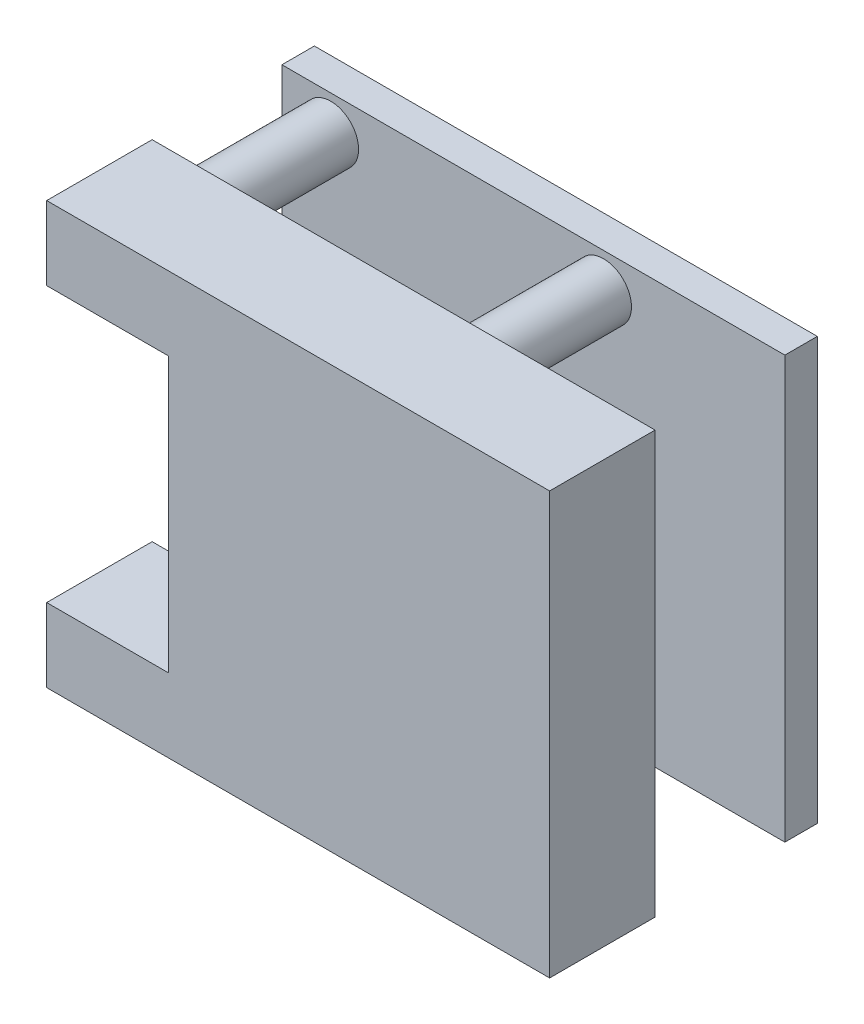
ISO-10303-21;
HEADER;
FILE_DESCRIPTION(('STEP AP214'),'2;1');
FILE_NAME('part.step','',(''),(''),'','','');
FILE_SCHEMA(('AUTOMOTIVE_DESIGN { 1 0 10303 214 1 1 1 1 }'));
ENDSEC;
DATA;
#1=APPLICATION_CONTEXT('core data for automotive mechanical design processes');
#2=APPLICATION_PROTOCOL_DEFINITION('international standard','automotive_design',2000,#1);
#3=PRODUCT_CONTEXT('',#1,'mechanical');
#4=PRODUCT('Part','Part','',(#3));
#5=PRODUCT_RELATED_PRODUCT_CATEGORY('part','',(#4));
#6=PRODUCT_DEFINITION_FORMATION('','',#4);
#7=PRODUCT_DEFINITION_CONTEXT('part definition',#1,'design');
#8=PRODUCT_DEFINITION('design','',#6,#7);
#9=PRODUCT_DEFINITION_SHAPE('','',#8);
#10=(LENGTH_UNIT() NAMED_UNIT(*) SI_UNIT(.MILLI.,.METRE.));
#11=(NAMED_UNIT(*) PLANE_ANGLE_UNIT() SI_UNIT($,.RADIAN.));
#12=(NAMED_UNIT(*) SI_UNIT($,.STERADIAN.) SOLID_ANGLE_UNIT());
#13=UNCERTAINTY_MEASURE_WITH_UNIT(LENGTH_MEASURE(1.E-05),#10,'distance_accuracy_value','');
#14=(GEOMETRIC_REPRESENTATION_CONTEXT(3) GLOBAL_UNCERTAINTY_ASSIGNED_CONTEXT((#13)) GLOBAL_UNIT_ASSIGNED_CONTEXT((#10,
#11,#12)) REPRESENTATION_CONTEXT('',''));
#15=CARTESIAN_POINT('',(0.,0.,0.));
#16=DIRECTION('',(0.,0.,1.));
#17=DIRECTION('',(1.,0.,0.));
#18=AXIS2_PLACEMENT_3D('',#15,#16,#17);
#19=CARTESIAN_POINT('',(0.,0.,16.5));
#20=DIRECTION('',(1.,0.,0.));
#21=DIRECTION('',(0.,0.,-1.));
#22=AXIS2_PLACEMENT_3D('',#19,#20,#21);
#23=PLANE('',#22);
#24=DIRECTION('',(0.,-1.,0.));
#25=VECTOR('',#24,1.);
#26=CARTESIAN_POINT('',(0.,0.,2.));
#27=LINE('',#26,#25);
#28=CARTESIAN_POINT('',(0.,26.,2.));
#29=VERTEX_POINT('',#28);
#30=CARTESIAN_POINT('',(0.,0.,2.));
#31=VERTEX_POINT('',#30);
#32=EDGE_CURVE('E172',#29,#31,#27,.T.);
#33=ORIENTED_EDGE('',*,*,#32,.F.);
#34=DIRECTION('',(0.,0.,-1.));
#35=VECTOR('',#34,1.);
#36=CARTESIAN_POINT('',(0.,26.,16.5));
#37=LINE('',#36,#35);
#38=CARTESIAN_POINT('',(0.,26.,0.));
#39=VERTEX_POINT('',#38);
#40=EDGE_CURVE('E166',#29,#39,#37,.T.);
#41=ORIENTED_EDGE('',*,*,#40,.T.);
#42=DIRECTION('',(0.,-1.,0.));
#43=VECTOR('',#42,1.);
#44=CARTESIAN_POINT('',(0.,0.,0.));
#45=LINE('',#44,#43);
#46=CARTESIAN_POINT('',(0.,0.,0.));
#47=VERTEX_POINT('',#46);
#48=EDGE_CURVE('E167',#39,#47,#45,.T.);
#49=ORIENTED_EDGE('',*,*,#48,.T.);
#50=DIRECTION('',(0.,0.,-1.));
#51=VECTOR('',#50,1.);
#52=CARTESIAN_POINT('',(0.,0.,16.5));
#53=LINE('',#52,#51);
#54=EDGE_CURVE('E196',#31,#47,#53,.T.);
#55=ORIENTED_EDGE('',*,*,#54,.F.);
#56=EDGE_LOOP('',(#33,#41,#49,#55));
#57=FACE_BOUND('',#56,.T.);
#58=ADVANCED_FACE('F39',(#57),#23,.F.);
#59=DIRECTION('',(0.,-1.,0.));
#60=VECTOR('',#59,1.);
#61=CARTESIAN_POINT('',(0.,0.,16.5));
#62=LINE('',#61,#60);
#63=CARTESIAN_POINT('',(0.,4.54167812983419,16.5));
#64=VERTEX_POINT('',#63);
#65=CARTESIAN_POINT('',(0.,0.,16.5));
#66=VERTEX_POINT('',#65);
#67=EDGE_CURVE('E151',#64,#66,#62,.T.);
#68=ORIENTED_EDGE('',*,*,#67,.F.);
#69=DIRECTION('',(0.,0.,1.));
#70=VECTOR('',#69,1.);
#71=CARTESIAN_POINT('',(0.,4.54167812983419,-16.5053993019197));
#72=LINE('',#71,#70);
#73=CARTESIAN_POINT('',(0.,4.54167812983419,10.));
#74=VERTEX_POINT('',#73);
#75=EDGE_CURVE('E143',#74,#64,#72,.T.);
#76=ORIENTED_EDGE('',*,*,#75,.F.);
#77=DIRECTION('',(0.,-1.,0.));
#78=VECTOR('',#77,1.);
#79=CARTESIAN_POINT('',(0.,0.,10.));
#80=LINE('',#79,#78);
#81=CARTESIAN_POINT('',(0.,0.,10.));
#82=VERTEX_POINT('',#81);
#83=EDGE_CURVE('E159',#74,#82,#80,.T.);
#84=ORIENTED_EDGE('',*,*,#83,.T.);
#85=EDGE_CURVE('E197',#66,#82,#53,.T.);
#86=ORIENTED_EDGE('',*,*,#85,.F.);
#87=EDGE_LOOP('',(#68,#76,#84,#86));
#88=FACE_BOUND('',#87,.T.);
#89=ADVANCED_FACE('F290',(#88),#23,.F.);
#90=CARTESIAN_POINT('',(0.,0.,16.5));
#91=DIRECTION('',(0.,1.,0.));
#92=DIRECTION('',(0.,0.,1.));
#93=AXIS2_PLACEMENT_3D('',#90,#91,#92);
#94=PLANE('',#93);
#95=DIRECTION('',(1.,0.,0.));
#96=VECTOR('',#95,1.);
#97=CARTESIAN_POINT('',(31.,0.,10.));
#98=LINE('',#97,#96);
#99=CARTESIAN_POINT('',(31.,0.,10.));
#100=VERTEX_POINT('',#99);
#101=EDGE_CURVE('E222',#82,#100,#98,.T.);
#102=ORIENTED_EDGE('',*,*,#101,.T.);
#103=DIRECTION('',(0.,0.,-1.));
#104=VECTOR('',#103,1.);
#105=CARTESIAN_POINT('',(31.,0.,16.5));
#106=LINE('',#105,#104);
#107=CARTESIAN_POINT('',(31.,0.,16.5));
#108=VERTEX_POINT('',#107);
#109=EDGE_CURVE('E192',#108,#100,#106,.T.);
#110=ORIENTED_EDGE('',*,*,#109,.F.);
#111=DIRECTION('',(1.,0.,0.));
#112=VECTOR('',#111,1.);
#113=CARTESIAN_POINT('',(0.,0.,16.5));
#114=LINE('',#113,#112);
#115=EDGE_CURVE('E150',#66,#108,#114,.T.);
#116=ORIENTED_EDGE('',*,*,#115,.F.);
#117=ORIENTED_EDGE('',*,*,#85,.T.);
#118=EDGE_LOOP('',(#102,#110,#116,#117));
#119=FACE_BOUND('',#118,.T.);
#120=ADVANCED_FACE('F292',(#119),#94,.F.);
#121=CARTESIAN_POINT('',(31.,0.,16.5));
#122=DIRECTION('',(-1.,0.,0.));
#123=DIRECTION('',(0.,0.,1.));
#124=AXIS2_PLACEMENT_3D('',#121,#122,#123);
#125=PLANE('',#124);
#126=DIRECTION('',(0.,1.,0.));
#127=VECTOR('',#126,1.);
#128=CARTESIAN_POINT('',(31.,26.,10.));
#129=LINE('',#128,#127);
#130=CARTESIAN_POINT('',(31.,26.,10.));
#131=VERTEX_POINT('',#130);
#132=EDGE_CURVE('E233',#100,#131,#129,.T.);
#133=ORIENTED_EDGE('',*,*,#132,.T.);
#134=DIRECTION('',(0.,0.,-1.));
#135=VECTOR('',#134,1.);
#136=CARTESIAN_POINT('',(31.,26.,16.5));
#137=LINE('',#136,#135);
#138=CARTESIAN_POINT('',(31.,26.,16.5));
#139=VERTEX_POINT('',#138);
#140=EDGE_CURVE('E187',#139,#131,#137,.T.);
#141=ORIENTED_EDGE('',*,*,#140,.F.);
#142=DIRECTION('',(0.,1.,0.));
#143=VECTOR('',#142,1.);
#144=CARTESIAN_POINT('',(31.,0.,16.5));
#145=LINE('',#144,#143);
#146=EDGE_CURVE('E155',#108,#139,#145,.T.);
#147=ORIENTED_EDGE('',*,*,#146,.F.);
#148=ORIENTED_EDGE('',*,*,#109,.T.);
#149=EDGE_LOOP('',(#133,#141,#147,#148));
#150=FACE_BOUND('',#149,.T.);
#151=ADVANCED_FACE('F297',(#150),#125,.F.);
#152=CARTESIAN_POINT('',(0.,26.,16.5));
#153=DIRECTION('',(0.,-1.,0.));
#154=DIRECTION('',(0.,0.,-1.));
#155=AXIS2_PLACEMENT_3D('',#152,#153,#154);
#156=PLANE('',#155);
#157=DIRECTION('',(-1.,0.,0.));
#158=VECTOR('',#157,1.);
#159=CARTESIAN_POINT('',(0.,26.,10.));
#160=LINE('',#159,#158);
#161=CARTESIAN_POINT('',(0.,26.,10.));
#162=VERTEX_POINT('',#161);
#163=EDGE_CURVE('E231',#131,#162,#160,.T.);
#164=ORIENTED_EDGE('',*,*,#163,.T.);
#165=CARTESIAN_POINT('',(0.,26.,16.5));
#166=VERTEX_POINT('',#165);
#167=EDGE_CURVE('E183',#166,#162,#37,.T.);
#168=ORIENTED_EDGE('',*,*,#167,.F.);
#169=DIRECTION('',(-1.,0.,0.));
#170=VECTOR('',#169,1.);
#171=CARTESIAN_POINT('',(0.,26.,16.5));
#172=LINE('',#171,#170);
#173=EDGE_CURVE('E147',#139,#166,#172,.T.);
#174=ORIENTED_EDGE('',*,*,#173,.F.);
#175=ORIENTED_EDGE('',*,*,#140,.T.);
#176=EDGE_LOOP('',(#164,#168,#174,#175));
#177=FACE_BOUND('',#176,.T.);
#178=ADVANCED_FACE('F299',(#177),#156,.F.);
#179=DIRECTION('',(0.,-1.,0.));
#180=VECTOR('',#179,1.);
#181=CARTESIAN_POINT('',(0.,21.3676644107974,10.));
#182=LINE('',#181,#180);
#183=CARTESIAN_POINT('',(0.,21.4583218701658,10.));
#184=VERTEX_POINT('',#183);
#185=EDGE_CURVE('E62',#162,#184,#182,.T.);
#186=ORIENTED_EDGE('',*,*,#185,.T.);
#187=DIRECTION('',(0.,0.,1.));
#188=VECTOR('',#187,1.);
#189=CARTESIAN_POINT('',(0.,21.4583218701658,-16.5053993019197));
#190=LINE('',#189,#188);
#191=CARTESIAN_POINT('',(0.,21.4583218701658,16.5));
#192=VERTEX_POINT('',#191);
#193=EDGE_CURVE('E55',#184,#192,#190,.T.);
#194=ORIENTED_EDGE('',*,*,#193,.T.);
#195=EDGE_CURVE('E141',#166,#192,#62,.T.);
#196=ORIENTED_EDGE('',*,*,#195,.F.);
#197=ORIENTED_EDGE('',*,*,#167,.T.);
#198=EDGE_LOOP('',(#186,#194,#196,#197));
#199=FACE_BOUND('',#198,.T.);
#200=ADVANCED_FACE('F41',(#199),#23,.F.);
#201=CARTESIAN_POINT('',(31.,0.,2.));
#202=VERTEX_POINT('',#201);
#203=CARTESIAN_POINT('',(31.,0.,0.));
#204=VERTEX_POINT('',#203);
#205=EDGE_CURVE('E191',#202,#204,#106,.T.);
#206=ORIENTED_EDGE('',*,*,#205,.F.);
#207=DIRECTION('',(1.,0.,0.));
#208=VECTOR('',#207,1.);
#209=CARTESIAN_POINT('',(31.,0.,2.));
#210=LINE('',#209,#208);
#211=EDGE_CURVE('E226',#31,#202,#210,.T.);
#212=ORIENTED_EDGE('',*,*,#211,.F.);
#213=ORIENTED_EDGE('',*,*,#54,.T.);
#214=DIRECTION('',(1.,0.,0.));
#215=VECTOR('',#214,1.);
#216=CARTESIAN_POINT('',(0.,0.,0.));
#217=LINE('',#216,#215);
#218=EDGE_CURVE('E171',#47,#204,#217,.T.);
#219=ORIENTED_EDGE('',*,*,#218,.T.);
#220=EDGE_LOOP('',(#206,#212,#213,#219));
#221=FACE_BOUND('',#220,.T.);
#222=ADVANCED_FACE('F307',(#221),#94,.F.);
#223=CARTESIAN_POINT('',(31.,26.,2.));
#224=VERTEX_POINT('',#223);
#225=CARTESIAN_POINT('',(31.,26.,0.));
#226=VERTEX_POINT('',#225);
#227=EDGE_CURVE('E186',#224,#226,#137,.T.);
#228=ORIENTED_EDGE('',*,*,#227,.F.);
#229=DIRECTION('',(0.,1.,0.));
#230=VECTOR('',#229,1.);
#231=CARTESIAN_POINT('',(31.,26.,2.));
#232=LINE('',#231,#230);
#233=EDGE_CURVE('E229',#202,#224,#232,.T.);
#234=ORIENTED_EDGE('',*,*,#233,.F.);
#235=ORIENTED_EDGE('',*,*,#205,.T.);
#236=DIRECTION('',(0.,1.,0.));
#237=VECTOR('',#236,1.);
#238=CARTESIAN_POINT('',(31.,0.,0.));
#239=LINE('',#238,#237);
#240=EDGE_CURVE('E176',#204,#226,#239,.T.);
#241=ORIENTED_EDGE('',*,*,#240,.T.);
#242=EDGE_LOOP('',(#228,#234,#235,#241));
#243=FACE_BOUND('',#242,.T.);
#244=ADVANCED_FACE('F309',(#243),#125,.F.);
#245=ORIENTED_EDGE('',*,*,#40,.F.);
#246=DIRECTION('',(-1.,0.,0.));
#247=VECTOR('',#246,1.);
#248=CARTESIAN_POINT('',(0.,26.,2.));
#249=LINE('',#248,#247);
#250=EDGE_CURVE('E244',#224,#29,#249,.T.);
#251=ORIENTED_EDGE('',*,*,#250,.F.);
#252=ORIENTED_EDGE('',*,*,#227,.T.);
#253=DIRECTION('',(-1.,0.,0.));
#254=VECTOR('',#253,1.);
#255=CARTESIAN_POINT('',(0.,26.,0.));
#256=LINE('',#255,#254);
#257=EDGE_CURVE('E157',#226,#39,#256,.T.);
#258=ORIENTED_EDGE('',*,*,#257,.T.);
#259=EDGE_LOOP('',(#245,#251,#252,#258));
#260=FACE_BOUND('',#259,.T.);
#261=ADVANCED_FACE('F302',(#260),#156,.F.);
#262=CARTESIAN_POINT('',(0.,0.,16.5));
#263=DIRECTION('',(0.,0.,-1.));
#264=DIRECTION('',(-1.,0.,0.));
#265=AXIS2_PLACEMENT_3D('',#262,#263,#264);
#266=PLANE('',#265);
#267=DIRECTION('',(0.,1.,0.));
#268=VECTOR('',#267,1.);
#269=CARTESIAN_POINT('',(7.50179764364433,21.4583218701658,16.5));
#270=LINE('',#269,#268);
#271=CARTESIAN_POINT('',(7.50179764364434,4.54167812983419,16.5));
#272=VERTEX_POINT('',#271);
#273=CARTESIAN_POINT('',(7.50179764364433,21.4583218701658,16.5));
#274=VERTEX_POINT('',#273);
#275=EDGE_CURVE('E136',#272,#274,#270,.T.);
#276=ORIENTED_EDGE('',*,*,#275,.F.);
#277=DIRECTION('',(1.,0.,0.));
#278=VECTOR('',#277,1.);
#279=CARTESIAN_POINT('',(0.,4.54167812983419,16.5));
#280=LINE('',#279,#278);
#281=EDGE_CURVE('E214',#64,#272,#280,.T.);
#282=ORIENTED_EDGE('',*,*,#281,.F.);
#283=ORIENTED_EDGE('',*,*,#67,.T.);
#284=ORIENTED_EDGE('',*,*,#115,.T.);
#285=ORIENTED_EDGE('',*,*,#146,.T.);
#286=ORIENTED_EDGE('',*,*,#173,.T.);
#287=ORIENTED_EDGE('',*,*,#195,.T.);
#288=DIRECTION('',(-1.,0.,0.));
#289=VECTOR('',#288,1.);
#290=CARTESIAN_POINT('',(0.,21.4583218701658,16.5));
#291=LINE('',#290,#289);
#292=EDGE_CURVE('E126',#274,#192,#291,.T.);
#293=ORIENTED_EDGE('',*,*,#292,.F.);
#294=EDGE_LOOP('',(#276,#282,#283,#284,#285,#286,#287,#293));
#295=FACE_BOUND('',#294,.T.);
#296=ADVANCED_FACE('F145',(#295),#266,.F.);
#297=CARTESIAN_POINT('',(0.,0.,0.));
#298=DIRECTION('',(0.,0.,-1.));
#299=DIRECTION('',(-1.,0.,0.));
#300=AXIS2_PLACEMENT_3D('',#297,#298,#299);
#301=PLANE('',#300);
#302=ORIENTED_EDGE('',*,*,#48,.F.);
#303=ORIENTED_EDGE('',*,*,#257,.F.);
#304=ORIENTED_EDGE('',*,*,#240,.F.);
#305=ORIENTED_EDGE('',*,*,#218,.F.);
#306=EDGE_LOOP('',(#302,#303,#304,#305));
#307=FACE_BOUND('',#306,.T.);
#308=ADVANCED_FACE('F338',(#307),#301,.T.);
#309=CARTESIAN_POINT('',(0.,0.,2.));
#310=DIRECTION('',(0.,0.,-1.));
#311=DIRECTION('',(-1.,0.,0.));
#312=AXIS2_PLACEMENT_3D('',#309,#310,#311);
#313=PLANE('',#312);
#314=ORIENTED_EDGE('',*,*,#250,.T.);
#315=ORIENTED_EDGE('',*,*,#32,.T.);
#316=ORIENTED_EDGE('',*,*,#211,.T.);
#317=ORIENTED_EDGE('',*,*,#233,.T.);
#318=EDGE_LOOP('',(#314,#315,#316,#317));
#319=FACE_BOUND('',#318,.T.);
#320=CARTESIAN_POINT('',(19.8304571600922,23.8418986767736,2.));
#321=DIRECTION('',(0.,0.,1.));
#322=DIRECTION('',(-1.,0.,0.));
#323=AXIS2_PLACEMENT_3D('',#320,#321,#322);
#324=CIRCLE('',#323,1.71578435381479);
#325=CARTESIAN_POINT('',(18.1146728062774,23.8418986767736,2.));
#326=VERTEX_POINT('',#325);
#327=EDGE_CURVE('E270',#326,#326,#324,.T.);
#328=ORIENTED_EDGE('',*,*,#327,.F.);
#329=EDGE_LOOP('',(#328));
#330=FACE_BOUND('',#329,.T.);
#331=CARTESIAN_POINT('',(3.01025210686046,23.8418986767736,2.));
#332=DIRECTION('',(0.,0.,1.));
#333=DIRECTION('',(-1.,0.,0.));
#334=AXIS2_PLACEMENT_3D('',#331,#332,#333);
#335=CIRCLE('',#334,1.71578435381479);
#336=CARTESIAN_POINT('',(1.29446775304567,23.8418986767736,2.));
#337=VERTEX_POINT('',#336);
#338=EDGE_CURVE('E262',#337,#337,#335,.T.);
#339=ORIENTED_EDGE('',*,*,#338,.F.);
#340=EDGE_LOOP('',(#339));
#341=FACE_BOUND('',#340,.T.);
#342=CARTESIAN_POINT('',(19.8304571600922,2.15810132322638,2.));
#343=DIRECTION('',(0.,0.,1.));
#344=DIRECTION('',(1.,0.,0.));
#345=AXIS2_PLACEMENT_3D('',#342,#343,#344);
#346=CIRCLE('',#345,1.71578435381479);
#347=CARTESIAN_POINT('',(21.546241513907,2.15810132322638,2.));
#348=VERTEX_POINT('',#347);
#349=EDGE_CURVE('E254',#348,#348,#346,.T.);
#350=ORIENTED_EDGE('',*,*,#349,.F.);
#351=EDGE_LOOP('',(#350));
#352=FACE_BOUND('',#351,.T.);
#353=CARTESIAN_POINT('',(3.01025210686046,2.15810132322638,2.));
#354=DIRECTION('',(0.,0.,1.));
#355=DIRECTION('',(1.,0.,0.));
#356=AXIS2_PLACEMENT_3D('',#353,#354,#355);
#357=CIRCLE('',#356,1.71578435381479);
#358=CARTESIAN_POINT('',(4.72603646067525,2.15810132322638,2.));
#359=VERTEX_POINT('',#358);
#360=EDGE_CURVE('E241',#359,#359,#357,.T.);
#361=ORIENTED_EDGE('',*,*,#360,.F.);
#362=EDGE_LOOP('',(#361));
#363=FACE_BOUND('',#362,.T.);
#364=ADVANCED_FACE('F323',(#319,#330,#341,#352,#363),#313,.F.);
#365=CARTESIAN_POINT('',(0.,0.,10.));
#366=DIRECTION('',(0.,0.,-1.));
#367=DIRECTION('',(-1.,0.,0.));
#368=AXIS2_PLACEMENT_3D('',#365,#366,#367);
#369=PLANE('',#368);
#370=DIRECTION('',(-1.,0.,0.));
#371=VECTOR('',#370,1.);
#372=CARTESIAN_POINT('',(0.,4.54167812983419,10.));
#373=LINE('',#372,#371);
#374=CARTESIAN_POINT('',(7.50179764364434,4.54167812983419,10.));
#375=VERTEX_POINT('',#374);
#376=EDGE_CURVE('E11',#375,#74,#373,.T.);
#377=ORIENTED_EDGE('',*,*,#376,.F.);
#378=DIRECTION('',(0.,-1.,0.));
#379=VECTOR('',#378,1.);
#380=CARTESIAN_POINT('',(7.50179764364434,0.,10.));
#381=LINE('',#380,#379);
#382=CARTESIAN_POINT('',(7.50179764364433,21.4583218701658,10.));
#383=VERTEX_POINT('',#382);
#384=EDGE_CURVE('E48',#383,#375,#381,.T.);
#385=ORIENTED_EDGE('',*,*,#384,.F.);
#386=DIRECTION('',(1.,0.,0.));
#387=VECTOR('',#386,1.);
#388=CARTESIAN_POINT('',(0.,21.4583218701658,10.));
#389=LINE('',#388,#387);
#390=EDGE_CURVE('E201',#184,#383,#389,.T.);
#391=ORIENTED_EDGE('',*,*,#390,.F.);
#392=ORIENTED_EDGE('',*,*,#185,.F.);
#393=ORIENTED_EDGE('',*,*,#163,.F.);
#394=ORIENTED_EDGE('',*,*,#132,.F.);
#395=ORIENTED_EDGE('',*,*,#101,.F.);
#396=ORIENTED_EDGE('',*,*,#83,.F.);
#397=EDGE_LOOP('',(#377,#385,#391,#392,#393,#394,#395,#396));
#398=FACE_BOUND('',#397,.T.);
#399=CARTESIAN_POINT('',(19.8304571600922,23.8418986767736,10.));
#400=DIRECTION('',(0.,0.,1.));
#401=DIRECTION('',(-1.,0.,0.));
#402=AXIS2_PLACEMENT_3D('',#399,#400,#401);
#403=CIRCLE('',#402,1.71578435381479);
#404=CARTESIAN_POINT('',(18.1146728062774,23.8418986767736,10.));
#405=VERTEX_POINT('',#404);
#406=EDGE_CURVE('E274',#405,#405,#403,.T.);
#407=ORIENTED_EDGE('',*,*,#406,.T.);
#408=EDGE_LOOP('',(#407));
#409=FACE_BOUND('',#408,.T.);
#410=CARTESIAN_POINT('',(3.01025210686046,23.8418986767736,10.));
#411=DIRECTION('',(0.,0.,1.));
#412=DIRECTION('',(-1.,0.,0.));
#413=AXIS2_PLACEMENT_3D('',#410,#411,#412);
#414=CIRCLE('',#413,1.71578435381479);
#415=CARTESIAN_POINT('',(1.29446775304567,23.8418986767736,10.));
#416=VERTEX_POINT('',#415);
#417=EDGE_CURVE('E266',#416,#416,#414,.T.);
#418=ORIENTED_EDGE('',*,*,#417,.T.);
#419=EDGE_LOOP('',(#418));
#420=FACE_BOUND('',#419,.T.);
#421=CARTESIAN_POINT('',(19.8304571600922,2.15810132322638,10.));
#422=DIRECTION('',(0.,0.,1.));
#423=DIRECTION('',(1.,0.,0.));
#424=AXIS2_PLACEMENT_3D('',#421,#422,#423);
#425=CIRCLE('',#424,1.71578435381479);
#426=CARTESIAN_POINT('',(21.546241513907,2.15810132322638,10.));
#427=VERTEX_POINT('',#426);
#428=EDGE_CURVE('E258',#427,#427,#425,.T.);
#429=ORIENTED_EDGE('',*,*,#428,.T.);
#430=EDGE_LOOP('',(#429));
#431=FACE_BOUND('',#430,.T.);
#432=CARTESIAN_POINT('',(3.01025210686046,2.15810132322638,10.));
#433=DIRECTION('',(0.,0.,1.));
#434=DIRECTION('',(1.,0.,0.));
#435=AXIS2_PLACEMENT_3D('',#432,#433,#434);
#436=CIRCLE('',#435,1.71578435381479);
#437=CARTESIAN_POINT('',(4.72603646067525,2.15810132322638,10.));
#438=VERTEX_POINT('',#437);
#439=EDGE_CURVE('E250',#438,#438,#436,.T.);
#440=ORIENTED_EDGE('',*,*,#439,.T.);
#441=EDGE_LOOP('',(#440));
#442=FACE_BOUND('',#441,.T.);
#443=ADVANCED_FACE('F218',(#398,#409,#420,#431,#442),#369,.T.);
#444=CARTESIAN_POINT('',(3.01025210686046,2.15810132322638,2.));
#445=DIRECTION('',(0.,0.,1.));
#446=DIRECTION('',(1.,0.,0.));
#447=AXIS2_PLACEMENT_3D('',#444,#445,#446);
#448=CYLINDRICAL_SURFACE('',#447,1.71578435381479);
#449=ORIENTED_EDGE('',*,*,#360,.T.);
#450=EDGE_LOOP('',(#449));
#451=FACE_BOUND('',#450,.T.);
#452=ORIENTED_EDGE('',*,*,#439,.F.);
#453=EDGE_LOOP('',(#452));
#454=FACE_BOUND('',#453,.T.);
#455=ADVANCED_FACE('F383',(#451,#454),#448,.T.);
#456=CARTESIAN_POINT('',(19.8304571600922,2.15810132322638,2.));
#457=DIRECTION('',(0.,0.,1.));
#458=DIRECTION('',(1.,0.,0.));
#459=AXIS2_PLACEMENT_3D('',#456,#457,#458);
#460=CYLINDRICAL_SURFACE('',#459,1.71578435381479);
#461=ORIENTED_EDGE('',*,*,#349,.T.);
#462=EDGE_LOOP('',(#461));
#463=FACE_BOUND('',#462,.T.);
#464=ORIENTED_EDGE('',*,*,#428,.F.);
#465=EDGE_LOOP('',(#464));
#466=FACE_BOUND('',#465,.T.);
#467=ADVANCED_FACE('F388',(#463,#466),#460,.T.);
#468=CARTESIAN_POINT('',(3.01025210686046,23.8418986767736,2.));
#469=DIRECTION('',(0.,0.,1.));
#470=DIRECTION('',(1.,0.,0.));
#471=AXIS2_PLACEMENT_3D('',#468,#469,#470);
#472=CYLINDRICAL_SURFACE('',#471,1.71578435381479);
#473=ORIENTED_EDGE('',*,*,#338,.T.);
#474=EDGE_LOOP('',(#473));
#475=FACE_BOUND('',#474,.T.);
#476=ORIENTED_EDGE('',*,*,#417,.F.);
#477=EDGE_LOOP('',(#476));
#478=FACE_BOUND('',#477,.T.);
#479=ADVANCED_FACE('F400',(#475,#478),#472,.T.);
#480=CARTESIAN_POINT('',(19.8304571600922,23.8418986767736,2.));
#481=DIRECTION('',(0.,0.,1.));
#482=DIRECTION('',(1.,0.,0.));
#483=AXIS2_PLACEMENT_3D('',#480,#481,#482);
#484=CYLINDRICAL_SURFACE('',#483,1.71578435381479);
#485=ORIENTED_EDGE('',*,*,#327,.T.);
#486=EDGE_LOOP('',(#485));
#487=FACE_BOUND('',#486,.T.);
#488=ORIENTED_EDGE('',*,*,#406,.F.);
#489=EDGE_LOOP('',(#488));
#490=FACE_BOUND('',#489,.T.);
#491=ADVANCED_FACE('F410',(#487,#490),#484,.T.);
#492=CARTESIAN_POINT('',(0.,21.4583218701658,-16.5053993019197));
#493=DIRECTION('',(0.,1.,0.));
#494=DIRECTION('',(0.,0.,1.));
#495=AXIS2_PLACEMENT_3D('',#492,#493,#494);
#496=PLANE('',#495);
#497=ORIENTED_EDGE('',*,*,#390,.T.);
#498=DIRECTION('',(0.,0.,1.));
#499=VECTOR('',#498,1.);
#500=CARTESIAN_POINT('',(7.50179764364433,21.4583218701658,-16.5053993019197));
#501=LINE('',#500,#499);
#502=EDGE_CURVE('E129',#383,#274,#501,.T.);
#503=ORIENTED_EDGE('',*,*,#502,.T.);
#504=ORIENTED_EDGE('',*,*,#292,.T.);
#505=ORIENTED_EDGE('',*,*,#193,.F.);
#506=EDGE_LOOP('',(#497,#503,#504,#505));
#507=FACE_BOUND('',#506,.T.);
#508=ADVANCED_FACE('F127',(#507),#496,.F.);
#509=CARTESIAN_POINT('',(7.50179764364433,21.4583218701658,-16.5053993019197));
#510=DIRECTION('',(1.,0.,0.));
#511=DIRECTION('',(0.,1.,0.));
#512=AXIS2_PLACEMENT_3D('',#509,#510,#511);
#513=PLANE('',#512);
#514=ORIENTED_EDGE('',*,*,#384,.T.);
#515=DIRECTION('',(0.,0.,1.));
#516=VECTOR('',#515,1.);
#517=CARTESIAN_POINT('',(7.50179764364434,4.54167812983419,-16.5053993019197));
#518=LINE('',#517,#516);
#519=EDGE_CURVE('E135',#375,#272,#518,.T.);
#520=ORIENTED_EDGE('',*,*,#519,.T.);
#521=ORIENTED_EDGE('',*,*,#275,.T.);
#522=ORIENTED_EDGE('',*,*,#502,.F.);
#523=EDGE_LOOP('',(#514,#520,#521,#522));
#524=FACE_BOUND('',#523,.T.);
#525=ADVANCED_FACE('F207',(#524),#513,.F.);
#526=CARTESIAN_POINT('',(0.,4.54167812983419,-16.5053993019197));
#527=DIRECTION('',(0.,-1.,0.));
#528=DIRECTION('',(0.,0.,-1.));
#529=AXIS2_PLACEMENT_3D('',#526,#527,#528);
#530=PLANE('',#529);
#531=ORIENTED_EDGE('',*,*,#376,.T.);
#532=ORIENTED_EDGE('',*,*,#75,.T.);
#533=ORIENTED_EDGE('',*,*,#281,.T.);
#534=ORIENTED_EDGE('',*,*,#519,.F.);
#535=EDGE_LOOP('',(#531,#532,#533,#534));
#536=FACE_BOUND('',#535,.T.);
#537=ADVANCED_FACE('F211',(#536),#530,.F.);
#538=CLOSED_SHELL('',(#58,#89,#120,#151,#178,#200,#222,#244,#261,#296,#308,#364,#443,#455,#467,
#479,#491,#508,#525,#537));
#539=MANIFOLD_SOLID_BREP('B2',#538);
#540=ADVANCED_BREP_SHAPE_REPRESENTATION('',(#18,#539),#14);
#541=SHAPE_DEFINITION_REPRESENTATION(#9,#540);
ENDSEC;
END-ISO-10303-21;
